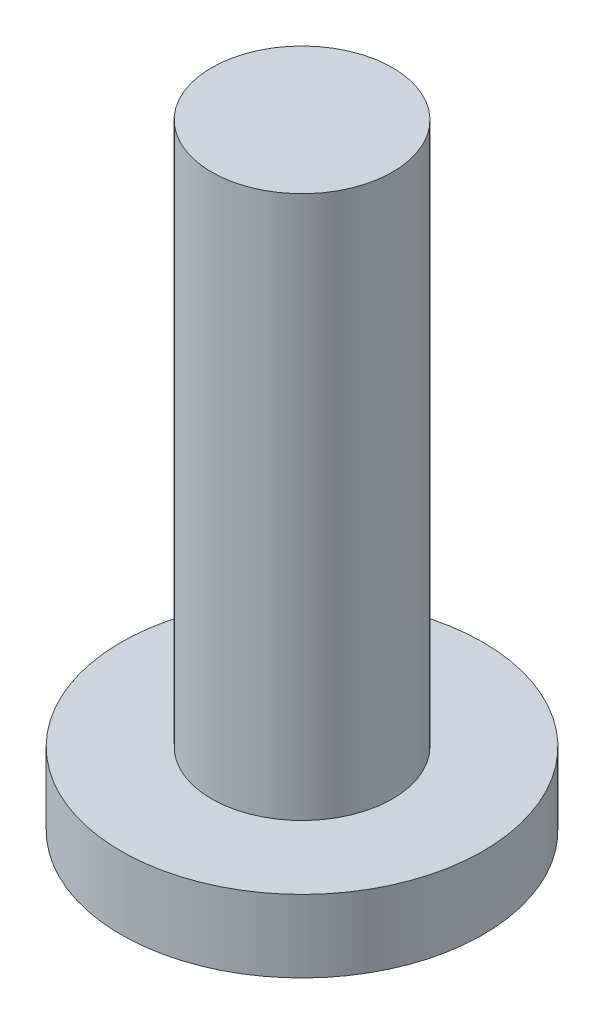
ISO-10303-21;
HEADER;
FILE_DESCRIPTION(('STEP AP214'),'2;1');
FILE_NAME('part.step','',(''),(''),'','','');
FILE_SCHEMA(('AUTOMOTIVE_DESIGN { 1 0 10303 214 1 1 1 1 }'));
ENDSEC;
DATA;
#1=APPLICATION_CONTEXT('core data for automotive mechanical design processes');
#2=APPLICATION_PROTOCOL_DEFINITION('international standard','automotive_design',2000,#1);
#3=PRODUCT_CONTEXT('',#1,'mechanical');
#4=PRODUCT('Part','Part','',(#3));
#5=PRODUCT_RELATED_PRODUCT_CATEGORY('part','',(#4));
#6=PRODUCT_DEFINITION_FORMATION('','',#4);
#7=PRODUCT_DEFINITION_CONTEXT('part definition',#1,'design');
#8=PRODUCT_DEFINITION('design','',#6,#7);
#9=PRODUCT_DEFINITION_SHAPE('','',#8);
#10=(LENGTH_UNIT() NAMED_UNIT(*) SI_UNIT(.MILLI.,.METRE.));
#11=(NAMED_UNIT(*) PLANE_ANGLE_UNIT() SI_UNIT($,.RADIAN.));
#12=(NAMED_UNIT(*) SI_UNIT($,.STERADIAN.) SOLID_ANGLE_UNIT());
#13=UNCERTAINTY_MEASURE_WITH_UNIT(LENGTH_MEASURE(1.E-05),#10,'distance_accuracy_value','');
#14=(GEOMETRIC_REPRESENTATION_CONTEXT(3) GLOBAL_UNCERTAINTY_ASSIGNED_CONTEXT((#13)) GLOBAL_UNIT_ASSIGNED_CONTEXT((#10,
#11,#12)) REPRESENTATION_CONTEXT('',''));
#15=CARTESIAN_POINT('',(0.,0.,0.));
#16=DIRECTION('',(0.,0.,1.));
#17=DIRECTION('',(1.,0.,0.));
#18=AXIS2_PLACEMENT_3D('',#15,#16,#17);
#19=CARTESIAN_POINT('',(0.,75.,0.));
#20=DIRECTION('',(0.,-1.,0.));
#21=DIRECTION('',(0.,0.,-1.));
#22=AXIS2_PLACEMENT_3D('',#19,#20,#21);
#23=CYLINDRICAL_SURFACE('',#22,12.5);
#24=CARTESIAN_POINT('',(0.,75.,0.));
#25=DIRECTION('',(0.,1.,0.));
#26=DIRECTION('',(0.,0.,1.));
#27=AXIS2_PLACEMENT_3D('',#24,#25,#26);
#28=CIRCLE('',#27,12.5);
#29=CARTESIAN_POINT('',(0.,75.,12.5));
#30=VERTEX_POINT('',#29);
#31=EDGE_CURVE('E10',#30,#30,#28,.T.);
#32=ORIENTED_EDGE('',*,*,#31,.F.);
#33=EDGE_LOOP('',(#32));
#34=FACE_BOUND('',#33,.T.);
#35=CARTESIAN_POINT('',(0.,0.,0.));
#36=DIRECTION('',(0.,1.,0.));
#37=DIRECTION('',(0.,0.,1.));
#38=AXIS2_PLACEMENT_3D('',#35,#36,#37);
#39=CIRCLE('',#38,12.5);
#40=CARTESIAN_POINT('',(0.,0.,12.5));
#41=VERTEX_POINT('',#40);
#42=EDGE_CURVE('E40',#41,#41,#39,.T.);
#43=ORIENTED_EDGE('',*,*,#42,.T.);
#44=EDGE_LOOP('',(#43));
#45=FACE_BOUND('',#44,.T.);
#46=ADVANCED_FACE('F37',(#34,#45),#23,.T.);
#47=CARTESIAN_POINT('',(0.,75.,0.));
#48=DIRECTION('',(0.,1.,0.));
#49=DIRECTION('',(0.,0.,1.));
#50=AXIS2_PLACEMENT_3D('',#47,#48,#49);
#51=PLANE('',#50);
#52=ORIENTED_EDGE('',*,*,#31,.T.);
#53=EDGE_LOOP('',(#52));
#54=FACE_BOUND('',#53,.T.);
#55=ADVANCED_FACE('F64',(#54),#51,.T.);
#56=CARTESIAN_POINT('',(0.,-10.,0.));
#57=DIRECTION('',(0.,1.,0.));
#58=DIRECTION('',(0.,0.,1.));
#59=AXIS2_PLACEMENT_3D('',#56,#57,#58);
#60=CYLINDRICAL_SURFACE('',#59,25.);
#61=CARTESIAN_POINT('',(0.,-10.,0.));
#62=DIRECTION('',(0.,-1.,0.));
#63=DIRECTION('',(0.,0.,-1.));
#64=AXIS2_PLACEMENT_3D('',#61,#62,#63);
#65=CIRCLE('',#64,25.);
#66=CARTESIAN_POINT('',(0.,-10.,-25.));
#67=VERTEX_POINT('',#66);
#68=EDGE_CURVE('E49',#67,#67,#65,.T.);
#69=ORIENTED_EDGE('',*,*,#68,.F.);
#70=EDGE_LOOP('',(#69));
#71=FACE_BOUND('',#70,.T.);
#72=CARTESIAN_POINT('',(0.,0.,0.));
#73=DIRECTION('',(0.,-1.,0.));
#74=DIRECTION('',(0.,0.,-1.));
#75=AXIS2_PLACEMENT_3D('',#72,#73,#74);
#76=CIRCLE('',#75,25.);
#77=CARTESIAN_POINT('',(0.,0.,-25.));
#78=VERTEX_POINT('',#77);
#79=EDGE_CURVE('E51',#78,#78,#76,.T.);
#80=ORIENTED_EDGE('',*,*,#79,.T.);
#81=EDGE_LOOP('',(#80));
#82=FACE_BOUND('',#81,.T.);
#83=ADVANCED_FACE('F61',(#71,#82),#60,.T.);
#84=CARTESIAN_POINT('',(0.,-10.,0.));
#85=DIRECTION('',(0.,-1.,0.));
#86=DIRECTION('',(0.,0.,-1.));
#87=AXIS2_PLACEMENT_3D('',#84,#85,#86);
#88=PLANE('',#87);
#89=ORIENTED_EDGE('',*,*,#68,.T.);
#90=EDGE_LOOP('',(#89));
#91=FACE_BOUND('',#90,.T.);
#92=ADVANCED_FACE('F59',(#91),#88,.T.);
#93=CARTESIAN_POINT('',(0.,0.,0.));
#94=DIRECTION('',(0.,-1.,0.));
#95=DIRECTION('',(0.,0.,-1.));
#96=AXIS2_PLACEMENT_3D('',#93,#94,#95);
#97=PLANE('',#96);
#98=ORIENTED_EDGE('',*,*,#42,.F.);
#99=EDGE_LOOP('',(#98));
#100=FACE_BOUND('',#99,.T.);
#101=ORIENTED_EDGE('',*,*,#79,.F.);
#102=EDGE_LOOP('',(#101));
#103=FACE_BOUND('',#102,.T.);
#104=ADVANCED_FACE('F68',(#100,#103),#97,.F.);
#105=CLOSED_SHELL('',(#46,#55,#83,#92,#104));
#106=MANIFOLD_SOLID_BREP('B2',#105);
#107=ADVANCED_BREP_SHAPE_REPRESENTATION('',(#18,#106),#14);
#108=SHAPE_DEFINITION_REPRESENTATION(#9,#107);
ENDSEC;
END-ISO-10303-21;
